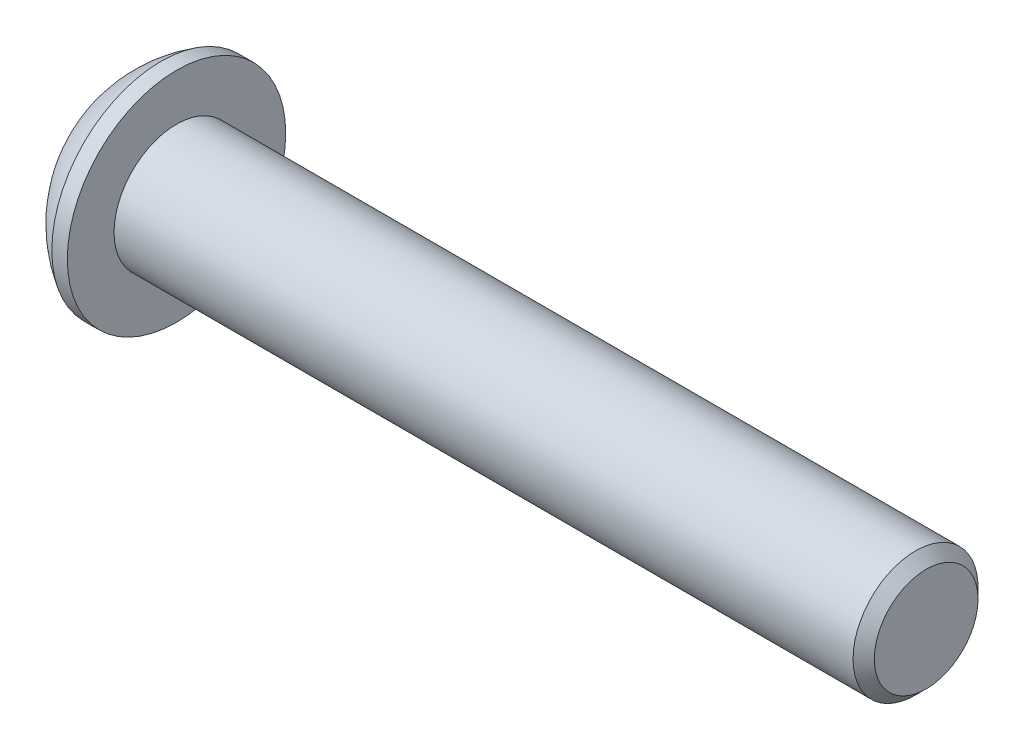
ISO-10303-21;
HEADER;
FILE_DESCRIPTION(('STEP AP214'),'2;1');
FILE_NAME('part.step','',(''),(''),'','','');
FILE_SCHEMA(('AUTOMOTIVE_DESIGN { 1 0 10303 214 1 1 1 1 }'));
ENDSEC;
DATA;
#1=APPLICATION_CONTEXT('core data for automotive mechanical design processes');
#2=APPLICATION_PROTOCOL_DEFINITION('international standard','automotive_design',2000,#1);
#3=PRODUCT_CONTEXT('',#1,'mechanical');
#4=PRODUCT('Part','Part','',(#3));
#5=PRODUCT_RELATED_PRODUCT_CATEGORY('part','',(#4));
#6=PRODUCT_DEFINITION_FORMATION('','',#4);
#7=PRODUCT_DEFINITION_CONTEXT('part definition',#1,'design');
#8=PRODUCT_DEFINITION('design','',#6,#7);
#9=PRODUCT_DEFINITION_SHAPE('','',#8);
#10=(LENGTH_UNIT() NAMED_UNIT(*) SI_UNIT(.MILLI.,.METRE.));
#11=(NAMED_UNIT(*) PLANE_ANGLE_UNIT() SI_UNIT($,.RADIAN.));
#12=(NAMED_UNIT(*) SI_UNIT($,.STERADIAN.) SOLID_ANGLE_UNIT());
#13=UNCERTAINTY_MEASURE_WITH_UNIT(LENGTH_MEASURE(1.E-05),#10,'distance_accuracy_value','');
#14=(GEOMETRIC_REPRESENTATION_CONTEXT(3) GLOBAL_UNCERTAINTY_ASSIGNED_CONTEXT((#13)) GLOBAL_UNIT_ASSIGNED_CONTEXT((#10,
#11,#12)) REPRESENTATION_CONTEXT('',''));
#15=CARTESIAN_POINT('',(0.,0.,0.));
#16=DIRECTION('',(0.,0.,1.));
#17=DIRECTION('',(1.,0.,0.));
#18=AXIS2_PLACEMENT_3D('',#15,#16,#17);
#19=CARTESIAN_POINT('',(0.,0.,0.));
#20=DIRECTION('',(-1.,0.,0.));
#21=DIRECTION('',(0.,0.,1.));
#22=AXIS2_PLACEMENT_3D('',#19,#20,#21);
#23=PLANE('',#22);
#24=CARTESIAN_POINT('',(0.,0.,0.));
#25=DIRECTION('',(-1.,0.,0.));
#26=DIRECTION('',(0.,0.,1.));
#27=AXIS2_PLACEMENT_3D('',#24,#25,#26);
#28=CIRCLE('',#27,2.77495);
#29=CARTESIAN_POINT('',(0.,2.77495,0.));
#30=VERTEX_POINT('',#29);
#31=EDGE_CURVE('E11',#30,#30,#28,.T.);
#32=ORIENTED_EDGE('',*,*,#31,.T.);
#33=EDGE_LOOP('',(#32));
#34=FACE_BOUND('',#33,.T.);
#35=DIRECTION('',(0.,-1.,0.));
#36=VECTOR('',#35,1.);
#37=CARTESIAN_POINT('',(0.,-1.14384635331849,1.9812));
#38=LINE('',#37,#36);
#39=CARTESIAN_POINT('',(0.,1.14384635331849,1.9812));
#40=VERTEX_POINT('',#39);
#41=CARTESIAN_POINT('',(0.,-1.14384635331849,1.9812));
#42=VERTEX_POINT('',#41);
#43=EDGE_CURVE('E46',#40,#42,#38,.T.);
#44=ORIENTED_EDGE('',*,*,#43,.T.);
#45=DIRECTION('',(0.,-0.5,-0.866025403784439));
#46=VECTOR('',#45,1.);
#47=CARTESIAN_POINT('',(0.,-2.28769270663697,0.));
#48=LINE('',#47,#46);
#49=CARTESIAN_POINT('',(0.,-2.28769270663697,0.));
#50=VERTEX_POINT('',#49);
#51=EDGE_CURVE('E362',#42,#50,#48,.T.);
#52=ORIENTED_EDGE('',*,*,#51,.T.);
#53=DIRECTION('',(0.,0.5,-0.866025403784439));
#54=VECTOR('',#53,1.);
#55=CARTESIAN_POINT('',(0.,-1.14384635331849,-1.9812));
#56=LINE('',#55,#54);
#57=CARTESIAN_POINT('',(0.,-1.14384635331849,-1.9812));
#58=VERTEX_POINT('',#57);
#59=EDGE_CURVE('E126',#50,#58,#56,.T.);
#60=ORIENTED_EDGE('',*,*,#59,.T.);
#61=DIRECTION('',(0.,1.,0.));
#62=VECTOR('',#61,1.);
#63=CARTESIAN_POINT('',(0.,1.14384635331849,-1.9812));
#64=LINE('',#63,#62);
#65=CARTESIAN_POINT('',(0.,1.14384635331849,-1.9812));
#66=VERTEX_POINT('',#65);
#67=EDGE_CURVE('E365',#58,#66,#64,.T.);
#68=ORIENTED_EDGE('',*,*,#67,.T.);
#69=DIRECTION('',(0.,0.5,0.866025403784439));
#70=VECTOR('',#69,1.);
#71=CARTESIAN_POINT('',(0.,2.28769270663697,0.));
#72=LINE('',#71,#70);
#73=CARTESIAN_POINT('',(0.,2.28769270663697,0.));
#74=VERTEX_POINT('',#73);
#75=EDGE_CURVE('E367',#66,#74,#72,.T.);
#76=ORIENTED_EDGE('',*,*,#75,.T.);
#77=DIRECTION('',(0.,-0.5,0.866025403784439));
#78=VECTOR('',#77,1.);
#79=CARTESIAN_POINT('',(0.,1.14384635331849,1.9812));
#80=LINE('',#79,#78);
#81=EDGE_CURVE('E369',#74,#40,#80,.T.);
#82=ORIENTED_EDGE('',*,*,#81,.T.);
#83=EDGE_LOOP('',(#44,#52,#60,#68,#76,#82));
#84=FACE_BOUND('',#83,.T.);
#85=ADVANCED_FACE('F32',(#34,#84),#23,.T.);
#86=CARTESIAN_POINT('',(5.78512506188119,0.,0.));
#87=DIRECTION('',(-1.,0.,0.));
#88=DIRECTION('',(0.,1.,0.));
#89=AXIS2_PLACEMENT_3D('',#86,#87,#88);
#90=SPHERICAL_SURFACE('',#89,6.41623094067739);
#91=CARTESIAN_POINT('',(2.5654,0.,0.));
#92=DIRECTION('',(-1.,0.,0.));
#93=DIRECTION('',(0.,0.,1.));
#94=AXIS2_PLACEMENT_3D('',#91,#92,#93);
#95=CIRCLE('',#94,5.5499);
#96=CARTESIAN_POINT('',(2.5654,5.5499,0.));
#97=VERTEX_POINT('',#96);
#98=EDGE_CURVE('E39',#97,#97,#95,.T.);
#99=CARTESIAN_POINT('',(2.5654,5.5499,0.));
#100=CARTESIAN_POINT('',(2.53083708566419,5.52984868712258,0.));
#101=CARTESIAN_POINT('',(2.49646152825914,5.50947442663449,0.));
#102=CARTESIAN_POINT('',(2.42809701945272,5.4680872977392,0.));
#103=CARTESIAN_POINT('',(2.39410806805135,5.447074429332,0.));
#104=CARTESIAN_POINT('',(2.32652866339446,5.40441737190071,0.));
#105=CARTESIAN_POINT('',(2.29293821013895,5.38277318287661,0.));
#106=CARTESIAN_POINT('',(2.22616751866502,5.33886105159856,0.));
#107=CARTESIAN_POINT('',(2.19298728044662,5.3165931093446,0.));
#108=CARTESIAN_POINT('',(2.12704860244366,5.27144124070729,0.));
#109=CARTESIAN_POINT('',(2.09429016265912,5.24855731432393,0.));
#110=CARTESIAN_POINT('',(2.02920651509859,5.20218146582175,0.));
#111=CARTESIAN_POINT('',(1.99688130732261,5.17868954370292,0.));
#112=CARTESIAN_POINT('',(1.93267540683267,5.13110590319174,0.));
#113=CARTESIAN_POINT('',(1.90079471411871,5.10701418479938,0.));
#114=CARTESIAN_POINT('',(1.83748897146475,5.05823936086598,0.));
#115=CARTESIAN_POINT('',(1.80606392152475,5.03355625532495,0.));
#116=CARTESIAN_POINT('',(1.74368043314138,4.98360727255644,0.));
#117=CARTESIAN_POINT('',(1.71272199469802,4.95834139532897,0.));
#118=CARTESIAN_POINT('',(1.65128253514951,4.90723568808467,0.));
#119=CARTESIAN_POINT('',(1.62080151404435,4.88139585806785,0.));
#120=CARTESIAN_POINT('',(1.56032752837792,4.82915126447052,0.));
#121=CARTESIAN_POINT('',(1.53033456381665,4.80274650089003,0.));
#122=CARTESIAN_POINT('',(1.4708471600897,4.74938125657909,0.));
#123=CARTESIAN_POINT('',(1.44135272092403,4.72242077584864,0.));
#124=CARTESIAN_POINT('',(1.38287266283316,4.66795350762059,0.));
#125=CARTESIAN_POINT('',(1.35388704390797,4.64044672012299,0.));
#126=CARTESIAN_POINT('',(1.29643474354244,4.58489643942841,0.));
#127=CARTESIAN_POINT('',(1.26796806210209,4.55685294623144,0.));
#128=CARTESIAN_POINT('',(1.21156357281885,4.50023904253955,0.));
#129=CARTESIAN_POINT('',(1.18362576497595,4.47166863204464,0.));
#130=CARTESIAN_POINT('',(1.12828877440023,4.41401086607543,0.));
#131=CARTESIAN_POINT('',(1.10088959166741,4.38492351060113,0.));
#132=CARTESIAN_POINT('',(1.04663941482087,4.32624200742801,0.));
#133=CARTESIAN_POINT('',(1.01978842070714,4.2966478597292,0.));
#134=CARTESIAN_POINT('',(0.966643993266069,4.2369631017545,0.));
#135=CARTESIAN_POINT('',(0.94035055993872,4.20687249147862,0.));
#136=CARTESIAN_POINT('',(0.888330431624668,4.14620531128432,0.));
#137=CARTESIAN_POINT('',(0.862603736637966,4.11562874136591,0.));
#138=CARTESIAN_POINT('',(0.811726064743087,4.05400031444217,0.));
#139=CARTESIAN_POINT('',(0.786575087834911,4.02294845743684,0.));
#140=CARTESIAN_POINT('',(0.736857630884291,3.96038029479081,0.));
#141=CARTESIAN_POINT('',(0.712291150841848,3.9288639891501,0.));
#142=CARTESIAN_POINT('',(0.6637512623949,3.8653779297977,0.));
#143=CARTESIAN_POINT('',(0.639777853990396,3.833408176086,0.));
#144=CARTESIAN_POINT('',(0.592432476584127,3.76902637942894,0.));
#145=CARTESIAN_POINT('',(0.569060507582362,3.73661433648358,0.));
#146=CARTESIAN_POINT('',(0.522926166816147,3.67135927457555,0.));
#147=CARTESIAN_POINT('',(0.500163795051696,3.63851625561289,0.));
#148=CARTESIAN_POINT('',(0.455256593824864,3.57241070531295,0.));
#149=CARTESIAN_POINT('',(0.433111764362482,3.53914817397566,0.));
#150=CARTESIAN_POINT('',(0.389447377232278,3.47221520900886,0.));
#151=CARTESIAN_POINT('',(0.367927819564456,3.43854477537934,0.));
#152=CARTESIAN_POINT('',(0.325521487354906,3.37080775824281,0.));
#153=CARTESIAN_POINT('',(0.304634712813178,3.3367411747358,0.));
#154=CARTESIAN_POINT('',(0.263501236996927,3.26822374869429,0.));
#155=CARTESIAN_POINT('',(0.243254535722403,3.23377290615979,0.));
#156=CARTESIAN_POINT('',(0.203408274368182,3.16449898643303,0.));
#157=CARTESIAN_POINT('',(0.183808714288484,3.12967590924077,0.));
#158=CARTESIAN_POINT('',(0.14526357289266,3.05966967674634,0.));
#159=CARTESIAN_POINT('',(0.126317991576534,3.02448652144419,0.));
#160=CARTESIAN_POINT('',(0.089087433723099,2.95377240655615,0.));
#161=CARTESIAN_POINT('',(0.0708024571857911,2.91824144697028,0.));
#162=CARTESIAN_POINT('',(0.0348994419493881,2.84684415010637,0.));
#163=CARTESIAN_POINT('',(0.017281403250293,2.81097781282834,0.));
#164=CARTESIAN_POINT('',(0.,2.77495,0.));
#165=B_SPLINE_CURVE_WITH_KNOTS('',3,(#99,#100,#101,#102,#103,#104,#105,#106,#107,#108,#109,#110,
#111,#112,#113,#114,#115,#116,#117,#118,#119,#120,#121,#122,#123,#124,#125,#126,#127,#128,#129,
#130,#131,#132,#133,#134,#135,#136,#137,#138,#139,#140,#141,#142,#143,#144,#145,#146,#147,#148,
#149,#150,#151,#152,#153,#154,#155,#156,#157,#158,#159,#160,#161,#162,#163,#164),.UNSPECIFIED.,
.F.,.F.,(4,2,2,2,2,2,2,2,2,2,2,2,2,2,2,2,2,2,2,2,2,2,2,2,2,2,2,2,2,2,2,2,4),(0.,
0.119872570538484,0.239745141076968,0.359617711615453,0.479490282153937,0.599362852692421,
0.719235423230905,0.83910799376939,0.958980564307873,1.07885313484636,1.19872570538484,
1.31859827592333,1.43847084646181,1.55834341700029,1.67821598753878,1.79808855807726,
1.91796112861575,2.03783369915423,2.15770626969271,2.2775788402312,2.39745141076968,
2.51732398130817,2.63719655184665,2.75706912238513,2.87694169292362,2.9968142634621,
3.11668683400059,3.23655940453907,3.35643197507756,3.47630454561604,3.59617711615452,
3.71604968669301,3.83592225723149),.UNSPECIFIED.);
#166=EDGE_CURVE('BSEAM153',#97,#30,#165,.T.);
#167=ORIENTED_EDGE('',*,*,#98,.T.);
#168=ORIENTED_EDGE('',*,*,#31,.F.);
#169=ORIENTED_EDGE('',*,*,#166,.T.);
#170=ORIENTED_EDGE('',*,*,#166,.F.);
#171=EDGE_LOOP('',(#167,#169,#168,#170));
#172=FACE_BOUND('',#171,.T.);
#173=ADVANCED_FACE('F153',(#172),#90,.T.);
#174=CARTESIAN_POINT('',(0.,0.,0.));
#175=DIRECTION('',(-1.,0.,0.));
#176=DIRECTION('',(0.,0.,1.));
#177=AXIS2_PLACEMENT_3D('',#174,#175,#176);
#178=CYLINDRICAL_SURFACE('',#177,5.5499);
#179=ORIENTED_EDGE('',*,*,#98,.F.);
#180=EDGE_LOOP('',(#179));
#181=FACE_BOUND('',#180,.T.);
#182=CARTESIAN_POINT('',(3.3528,0.,0.));
#183=DIRECTION('',(-1.,0.,0.));
#184=DIRECTION('',(0.,0.,1.));
#185=AXIS2_PLACEMENT_3D('',#182,#183,#184);
#186=CIRCLE('',#185,5.5499);
#187=CARTESIAN_POINT('',(3.3528,0.,5.5499));
#188=VERTEX_POINT('',#187);
#189=EDGE_CURVE('E148',#188,#188,#186,.T.);
#190=ORIENTED_EDGE('',*,*,#189,.T.);
#191=EDGE_LOOP('',(#190));
#192=FACE_BOUND('',#191,.T.);
#193=ADVANCED_FACE('F156',(#181,#192),#178,.T.);
#194=CARTESIAN_POINT('',(3.3528,3.17499999999999,0.));
#195=DIRECTION('',(-1.,0.,0.));
#196=DIRECTION('',(0.,0.,1.));
#197=AXIS2_PLACEMENT_3D('',#194,#195,#196);
#198=PLANE('',#197);
#199=ORIENTED_EDGE('',*,*,#189,.F.);
#200=EDGE_LOOP('',(#199));
#201=FACE_BOUND('',#200,.T.);
#202=CARTESIAN_POINT('',(3.3528,0.,0.));
#203=DIRECTION('',(-1.,0.,0.));
#204=DIRECTION('',(0.,0.,1.));
#205=AXIS2_PLACEMENT_3D('',#202,#203,#204);
#206=CIRCLE('',#205,3.17499999999999);
#207=CARTESIAN_POINT('',(3.3528,0.,3.17499999999999));
#208=VERTEX_POINT('',#207);
#209=EDGE_CURVE('E145',#208,#208,#206,.T.);
#210=ORIENTED_EDGE('',*,*,#209,.T.);
#211=EDGE_LOOP('',(#210));
#212=FACE_BOUND('',#211,.T.);
#213=ADVANCED_FACE('F159',(#201,#212),#198,.F.);
#214=CARTESIAN_POINT('',(0.,0.,0.));
#215=DIRECTION('',(-1.,0.,0.));
#216=DIRECTION('',(0.,0.,1.));
#217=AXIS2_PLACEMENT_3D('',#214,#215,#216);
#218=CYLINDRICAL_SURFACE('',#217,3.175);
#219=ORIENTED_EDGE('',*,*,#209,.F.);
#220=EDGE_LOOP('',(#219));
#221=FACE_BOUND('',#220,.T.);
#222=CARTESIAN_POINT('',(40.91178,0.,0.));
#223=DIRECTION('',(-1.,0.,0.));
#224=DIRECTION('',(0.,0.,1.));
#225=AXIS2_PLACEMENT_3D('',#222,#223,#224);
#226=CIRCLE('',#225,3.175);
#227=CARTESIAN_POINT('',(40.91178,0.,3.175));
#228=VERTEX_POINT('',#227);
#229=EDGE_CURVE('E142',#228,#228,#226,.T.);
#230=ORIENTED_EDGE('',*,*,#229,.T.);
#231=EDGE_LOOP('',(#230));
#232=FACE_BOUND('',#231,.T.);
#233=ADVANCED_FACE('F165',(#221,#232),#218,.T.);
#234=CARTESIAN_POINT('',(41.4528,0.,0.));
#235=DIRECTION('',(-1.,0.,0.));
#236=DIRECTION('',(0.,0.,1.));
#237=AXIS2_PLACEMENT_3D('',#234,#235,#236);
#238=CONICAL_SURFACE('',#237,2.63398,0.785398163397452);
#239=ORIENTED_EDGE('',*,*,#229,.F.);
#240=EDGE_LOOP('',(#239));
#241=FACE_BOUND('',#240,.T.);
#242=CARTESIAN_POINT('',(41.4528,0.,0.));
#243=DIRECTION('',(-1.,0.,0.));
#244=DIRECTION('',(0.,0.,1.));
#245=AXIS2_PLACEMENT_3D('',#242,#243,#244);
#246=CIRCLE('',#245,2.63398);
#247=CARTESIAN_POINT('',(41.4528,0.,2.63398));
#248=VERTEX_POINT('',#247);
#249=EDGE_CURVE('E138',#248,#248,#246,.T.);
#250=ORIENTED_EDGE('',*,*,#249,.T.);
#251=EDGE_LOOP('',(#250));
#252=FACE_BOUND('',#251,.T.);
#253=ADVANCED_FACE('F171',(#241,#252),#238,.T.);
#254=CARTESIAN_POINT('',(41.4528,0.,0.));
#255=DIRECTION('',(-1.,0.,0.));
#256=DIRECTION('',(0.,0.,1.));
#257=AXIS2_PLACEMENT_3D('',#254,#255,#256);
#258=PLANE('',#257);
#259=ORIENTED_EDGE('',*,*,#249,.F.);
#260=EDGE_LOOP('',(#259));
#261=FACE_BOUND('',#260,.T.);
#262=ADVANCED_FACE('F177',(#261),#258,.F.);
#263=CARTESIAN_POINT('',(2.2098,-2.28769270663697,0.));
#264=DIRECTION('',(0.,0.866025403784439,-0.5));
#265=DIRECTION('',(0.,0.5,0.866025403784439));
#266=AXIS2_PLACEMENT_3D('',#263,#264,#265);
#267=PLANE('',#266);
#268=DIRECTION('',(0.,-0.5,-0.866025403784439));
#269=VECTOR('',#268,1.);
#270=CARTESIAN_POINT('',(2.2098,-2.28769270663697,0.));
#271=LINE('',#270,#269);
#272=CARTESIAN_POINT('',(2.2098,-1.14384635331849,1.9812));
#273=VERTEX_POINT('',#272);
#274=CARTESIAN_POINT('',(2.2098,-1.71576952997773,0.9906));
#275=VERTEX_POINT('',#274);
#276=EDGE_CURVE('E112',#273,#275,#271,.T.);
#277=ORIENTED_EDGE('',*,*,#276,.T.);
#278=CARTESIAN_POINT('',(2.2098,-2.28769270663697,0.));
#279=VERTEX_POINT('',#278);
#280=EDGE_CURVE('E107',#275,#279,#271,.T.);
#281=ORIENTED_EDGE('',*,*,#280,.T.);
#282=DIRECTION('',(-1.,0.,0.));
#283=VECTOR('',#282,1.);
#284=CARTESIAN_POINT('',(2.2098,-2.28769270663697,0.));
#285=LINE('',#284,#283);
#286=EDGE_CURVE('E109',#279,#50,#285,.T.);
#287=ORIENTED_EDGE('',*,*,#286,.T.);
#288=ORIENTED_EDGE('',*,*,#51,.F.);
#289=DIRECTION('',(-1.,0.,0.));
#290=VECTOR('',#289,1.);
#291=CARTESIAN_POINT('',(2.2098,-1.14384635331849,1.9812));
#292=LINE('',#291,#290);
#293=EDGE_CURVE('E357',#273,#42,#292,.T.);
#294=ORIENTED_EDGE('',*,*,#293,.F.);
#295=EDGE_LOOP('',(#277,#281,#287,#288,#294));
#296=FACE_BOUND('',#295,.T.);
#297=ADVANCED_FACE('F108',(#296),#267,.T.);
#298=CARTESIAN_POINT('',(2.2098,-1.14384635331849,-1.9812));
#299=DIRECTION('',(0.,0.866025403784439,0.5));
#300=DIRECTION('',(0.,-0.5,0.866025403784439));
#301=AXIS2_PLACEMENT_3D('',#298,#299,#300);
#302=PLANE('',#301);
#303=DIRECTION('',(0.,0.5,-0.866025403784439));
#304=VECTOR('',#303,1.);
#305=CARTESIAN_POINT('',(2.2098,-1.14384635331849,-1.9812));
#306=LINE('',#305,#304);
#307=CARTESIAN_POINT('',(2.2098,-1.71576952997773,-0.9906));
#308=VERTEX_POINT('',#307);
#309=EDGE_CURVE('E54',#279,#308,#306,.T.);
#310=ORIENTED_EDGE('',*,*,#309,.T.);
#311=CARTESIAN_POINT('',(2.2098,-1.14384635331849,-1.9812));
#312=VERTEX_POINT('',#311);
#313=EDGE_CURVE('E121',#308,#312,#306,.T.);
#314=ORIENTED_EDGE('',*,*,#313,.T.);
#315=DIRECTION('',(-1.,0.,0.));
#316=VECTOR('',#315,1.);
#317=CARTESIAN_POINT('',(2.2098,-1.14384635331849,-1.9812));
#318=LINE('',#317,#316);
#319=EDGE_CURVE('E128',#312,#58,#318,.T.);
#320=ORIENTED_EDGE('',*,*,#319,.T.);
#321=ORIENTED_EDGE('',*,*,#59,.F.);
#322=ORIENTED_EDGE('',*,*,#286,.F.);
#323=EDGE_LOOP('',(#310,#314,#320,#321,#322));
#324=FACE_BOUND('',#323,.T.);
#325=ADVANCED_FACE('F124',(#324),#302,.T.);
#326=CARTESIAN_POINT('',(2.2098,1.14384635331849,-1.9812));
#327=DIRECTION('',(0.,0.,1.));
#328=DIRECTION('',(1.,0.,0.));
#329=AXIS2_PLACEMENT_3D('',#326,#327,#328);
#330=PLANE('',#329);
#331=DIRECTION('',(0.,1.,0.));
#332=VECTOR('',#331,1.);
#333=CARTESIAN_POINT('',(2.2098,1.14384635331849,-1.9812));
#334=LINE('',#333,#332);
#335=CARTESIAN_POINT('',(2.2098,0.,-1.9812));
#336=VERTEX_POINT('',#335);
#337=EDGE_CURVE('E387',#312,#336,#334,.T.);
#338=ORIENTED_EDGE('',*,*,#337,.T.);
#339=CARTESIAN_POINT('',(2.2098,1.14384635331849,-1.9812));
#340=VERTEX_POINT('',#339);
#341=EDGE_CURVE('E120',#336,#340,#334,.T.);
#342=ORIENTED_EDGE('',*,*,#341,.T.);
#343=DIRECTION('',(-1.,0.,0.));
#344=VECTOR('',#343,1.);
#345=CARTESIAN_POINT('',(2.2098,1.14384635331849,-1.9812));
#346=LINE('',#345,#344);
#347=EDGE_CURVE('E133',#340,#66,#346,.T.);
#348=ORIENTED_EDGE('',*,*,#347,.T.);
#349=ORIENTED_EDGE('',*,*,#67,.F.);
#350=ORIENTED_EDGE('',*,*,#319,.F.);
#351=EDGE_LOOP('',(#338,#342,#348,#349,#350));
#352=FACE_BOUND('',#351,.T.);
#353=ADVANCED_FACE('F236',(#352),#330,.T.);
#354=CARTESIAN_POINT('',(2.2098,2.28769270663697,0.));
#355=DIRECTION('',(0.,-0.866025403784439,0.5));
#356=DIRECTION('',(0.,-0.5,-0.866025403784439));
#357=AXIS2_PLACEMENT_3D('',#354,#355,#356);
#358=PLANE('',#357);
#359=DIRECTION('',(0.,0.5,0.866025403784439));
#360=VECTOR('',#359,1.);
#361=CARTESIAN_POINT('',(2.2098,2.28769270663697,0.));
#362=LINE('',#361,#360);
#363=CARTESIAN_POINT('',(2.2098,1.71576952997773,-0.990600000000001));
#364=VERTEX_POINT('',#363);
#365=EDGE_CURVE('E391',#340,#364,#362,.T.);
#366=ORIENTED_EDGE('',*,*,#365,.T.);
#367=CARTESIAN_POINT('',(2.2098,2.28769270663697,0.));
#368=VERTEX_POINT('',#367);
#369=EDGE_CURVE('E389',#364,#368,#362,.T.);
#370=ORIENTED_EDGE('',*,*,#369,.T.);
#371=DIRECTION('',(-1.,0.,0.));
#372=VECTOR('',#371,1.);
#373=CARTESIAN_POINT('',(2.2098,2.28769270663697,0.));
#374=LINE('',#373,#372);
#375=EDGE_CURVE('E373',#368,#74,#374,.T.);
#376=ORIENTED_EDGE('',*,*,#375,.T.);
#377=ORIENTED_EDGE('',*,*,#75,.F.);
#378=ORIENTED_EDGE('',*,*,#347,.F.);
#379=EDGE_LOOP('',(#366,#370,#376,#377,#378));
#380=FACE_BOUND('',#379,.T.);
#381=ADVANCED_FACE('F245',(#380),#358,.T.);
#382=CARTESIAN_POINT('',(2.2098,1.14384635331849,1.9812));
#383=DIRECTION('',(0.,-0.866025403784439,-0.5));
#384=DIRECTION('',(0.,0.5,-0.866025403784439));
#385=AXIS2_PLACEMENT_3D('',#382,#383,#384);
#386=PLANE('',#385);
#387=DIRECTION('',(0.,-0.5,0.866025403784439));
#388=VECTOR('',#387,1.);
#389=CARTESIAN_POINT('',(2.2098,1.14384635331849,1.9812));
#390=LINE('',#389,#388);
#391=CARTESIAN_POINT('',(2.2098,1.71576952997773,0.990600000000001));
#392=VERTEX_POINT('',#391);
#393=EDGE_CURVE('E352',#368,#392,#390,.T.);
#394=ORIENTED_EDGE('',*,*,#393,.T.);
#395=CARTESIAN_POINT('',(2.2098,1.14384635331849,1.9812));
#396=VERTEX_POINT('',#395);
#397=EDGE_CURVE('E348',#392,#396,#390,.T.);
#398=ORIENTED_EDGE('',*,*,#397,.T.);
#399=DIRECTION('',(-1.,0.,0.));
#400=VECTOR('',#399,1.);
#401=CARTESIAN_POINT('',(2.2098,1.14384635331849,1.9812));
#402=LINE('',#401,#400);
#403=EDGE_CURVE('E356',#396,#40,#402,.T.);
#404=ORIENTED_EDGE('',*,*,#403,.T.);
#405=ORIENTED_EDGE('',*,*,#81,.F.);
#406=ORIENTED_EDGE('',*,*,#375,.F.);
#407=EDGE_LOOP('',(#394,#398,#404,#405,#406));
#408=FACE_BOUND('',#407,.T.);
#409=ADVANCED_FACE('F255',(#408),#386,.T.);
#410=CARTESIAN_POINT('',(2.2098,-1.14384635331849,1.9812));
#411=DIRECTION('',(0.,0.,-1.));
#412=DIRECTION('',(0.,1.,0.));
#413=AXIS2_PLACEMENT_3D('',#410,#411,#412);
#414=PLANE('',#413);
#415=DIRECTION('',(0.,-1.,0.));
#416=VECTOR('',#415,1.);
#417=CARTESIAN_POINT('',(2.2098,-1.14384635331849,1.9812));
#418=LINE('',#417,#416);
#419=CARTESIAN_POINT('',(2.2098,0.,1.9812));
#420=VERTEX_POINT('',#419);
#421=EDGE_CURVE('E347',#396,#420,#418,.T.);
#422=ORIENTED_EDGE('',*,*,#421,.T.);
#423=EDGE_CURVE('E350',#420,#273,#418,.T.);
#424=ORIENTED_EDGE('',*,*,#423,.T.);
#425=ORIENTED_EDGE('',*,*,#293,.T.);
#426=ORIENTED_EDGE('',*,*,#43,.F.);
#427=ORIENTED_EDGE('',*,*,#403,.F.);
#428=EDGE_LOOP('',(#422,#424,#425,#426,#427));
#429=FACE_BOUND('',#428,.T.);
#430=ADVANCED_FACE('F265',(#429),#414,.T.);
#431=CARTESIAN_POINT('',(2.2098,-2.28769270663697,0.));
#432=DIRECTION('',(1.,0.,0.));
#433=DIRECTION('',(0.,0.,-1.));
#434=AXIS2_PLACEMENT_3D('',#431,#432,#433);
#435=PLANE('',#434);
#436=CARTESIAN_POINT('',(2.2098,0.,0.));
#437=DIRECTION('',(-1.,0.,0.));
#438=DIRECTION('',(0.,0.,1.));
#439=AXIS2_PLACEMENT_3D('',#436,#437,#438);
#440=CIRCLE('',#439,1.9812);
#441=EDGE_CURVE('E394',#364,#336,#440,.T.);
#442=ORIENTED_EDGE('',*,*,#441,.F.);
#443=ORIENTED_EDGE('',*,*,#365,.F.);
#444=ORIENTED_EDGE('',*,*,#341,.F.);
#445=EDGE_LOOP('',(#442,#443,#444));
#446=FACE_BOUND('',#445,.T.);
#447=ADVANCED_FACE('F275',(#446),#435,.F.);
#448=EDGE_CURVE('E139',#392,#364,#440,.T.);
#449=ORIENTED_EDGE('',*,*,#448,.F.);
#450=ORIENTED_EDGE('',*,*,#393,.F.);
#451=ORIENTED_EDGE('',*,*,#369,.F.);
#452=EDGE_LOOP('',(#449,#450,#451));
#453=FACE_BOUND('',#452,.T.);
#454=ADVANCED_FACE('F285',(#453),#435,.F.);
#455=EDGE_CURVE('E132',#420,#392,#440,.T.);
#456=ORIENTED_EDGE('',*,*,#455,.F.);
#457=ORIENTED_EDGE('',*,*,#421,.F.);
#458=ORIENTED_EDGE('',*,*,#397,.F.);
#459=EDGE_LOOP('',(#456,#457,#458));
#460=FACE_BOUND('',#459,.T.);
#461=ADVANCED_FACE('F296',(#460),#435,.F.);
#462=EDGE_CURVE('E127',#275,#420,#440,.T.);
#463=ORIENTED_EDGE('',*,*,#462,.F.);
#464=ORIENTED_EDGE('',*,*,#276,.F.);
#465=ORIENTED_EDGE('',*,*,#423,.F.);
#466=EDGE_LOOP('',(#463,#464,#465));
#467=FACE_BOUND('',#466,.T.);
#468=ADVANCED_FACE('F305',(#467),#435,.F.);
#469=EDGE_CURVE('E118',#308,#275,#440,.T.);
#470=ORIENTED_EDGE('',*,*,#469,.F.);
#471=ORIENTED_EDGE('',*,*,#309,.F.);
#472=ORIENTED_EDGE('',*,*,#280,.F.);
#473=EDGE_LOOP('',(#470,#471,#472));
#474=FACE_BOUND('',#473,.T.);
#475=ADVANCED_FACE('F117',(#474),#435,.F.);
#476=EDGE_CURVE('E388',#336,#308,#440,.T.);
#477=ORIENTED_EDGE('',*,*,#476,.F.);
#478=ORIENTED_EDGE('',*,*,#337,.F.);
#479=ORIENTED_EDGE('',*,*,#313,.F.);
#480=EDGE_LOOP('',(#477,#478,#479));
#481=FACE_BOUND('',#480,.T.);
#482=ADVANCED_FACE('F288',(#481),#435,.F.);
#483=CARTESIAN_POINT('',(3.3536463533185,0.,0.));
#484=DIRECTION('',(-1.,0.,0.));
#485=DIRECTION('',(0.,0.,1.));
#486=AXIS2_PLACEMENT_3D('',#483,#484,#485);
#487=CONICAL_SURFACE('',#486,0.,1.04719755119659);
#488=ORIENTED_EDGE('',*,*,#455,.T.);
#489=ORIENTED_EDGE('',*,*,#448,.T.);
#490=ORIENTED_EDGE('',*,*,#441,.T.);
#491=ORIENTED_EDGE('',*,*,#476,.T.);
#492=ORIENTED_EDGE('',*,*,#469,.T.);
#493=ORIENTED_EDGE('',*,*,#462,.T.);
#494=EDGE_LOOP('',(#488,#489,#490,#491,#492,#493));
#495=FACE_BOUND('',#494,.T.);
#496=CARTESIAN_POINT('',(3.3536463533185,0.,0.));
#497=VERTEX_POINT('',#496);
#498=VERTEX_LOOP('',#497);
#499=FACE_BOUND('',#498,.T.);
#500=ADVANCED_FACE('F329',(#495,#499),#487,.F.);
#501=CLOSED_SHELL('',(#85,#173,#193,#213,#233,#253,#262,#297,#325,#353,#381,#409,#430,#447,#454,
#461,#468,#475,#482,#500));
#502=MANIFOLD_SOLID_BREP('B2',#501);
#503=ADVANCED_BREP_SHAPE_REPRESENTATION('',(#18,#502),#14);
#504=SHAPE_DEFINITION_REPRESENTATION(#9,#503);
ENDSEC;
END-ISO-10303-21;
